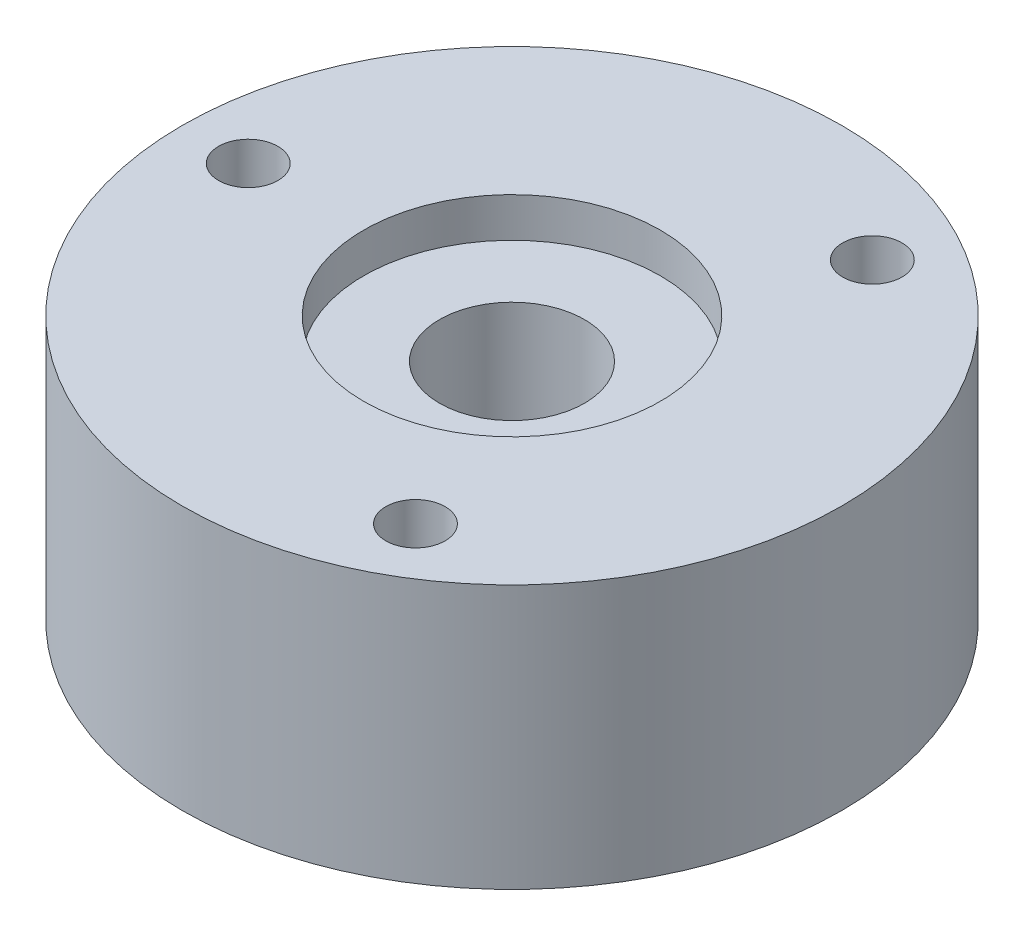
ISO-10303-21;
HEADER;
FILE_DESCRIPTION(('STEP AP214'),'2;1');
FILE_NAME('part.step','',(''),(''),'','','');
FILE_SCHEMA(('AUTOMOTIVE_DESIGN { 1 0 10303 214 1 1 1 1 }'));
ENDSEC;
DATA;
#1=APPLICATION_CONTEXT('core data for automotive mechanical design processes');
#2=APPLICATION_PROTOCOL_DEFINITION('international standard','automotive_design',2000,#1);
#3=PRODUCT_CONTEXT('',#1,'mechanical');
#4=PRODUCT('Part','Part','',(#3));
#5=PRODUCT_RELATED_PRODUCT_CATEGORY('part','',(#4));
#6=PRODUCT_DEFINITION_FORMATION('','',#4);
#7=PRODUCT_DEFINITION_CONTEXT('part definition',#1,'design');
#8=PRODUCT_DEFINITION('design','',#6,#7);
#9=PRODUCT_DEFINITION_SHAPE('','',#8);
#10=(LENGTH_UNIT() NAMED_UNIT(*) SI_UNIT(.MILLI.,.METRE.));
#11=(NAMED_UNIT(*) PLANE_ANGLE_UNIT() SI_UNIT($,.RADIAN.));
#12=(NAMED_UNIT(*) SI_UNIT($,.STERADIAN.) SOLID_ANGLE_UNIT());
#13=UNCERTAINTY_MEASURE_WITH_UNIT(LENGTH_MEASURE(1.E-05),#10,'distance_accuracy_value','');
#14=(GEOMETRIC_REPRESENTATION_CONTEXT(3) GLOBAL_UNCERTAINTY_ASSIGNED_CONTEXT((#13)) GLOBAL_UNIT_ASSIGNED_CONTEXT((#10,
#11,#12)) REPRESENTATION_CONTEXT('',''));
#15=CARTESIAN_POINT('',(0.,0.,0.));
#16=DIRECTION('',(0.,0.,1.));
#17=DIRECTION('',(1.,0.,0.));
#18=AXIS2_PLACEMENT_3D('',#15,#16,#17);
#19=CARTESIAN_POINT('',(0.,20.,0.));
#20=DIRECTION('',(0.,-1.,0.));
#21=DIRECTION('',(0.,0.,-1.));
#22=AXIS2_PLACEMENT_3D('',#19,#20,#21);
#23=CYLINDRICAL_SURFACE('',#22,5.5);
#24=CARTESIAN_POINT('',(0.,0.,0.));
#25=DIRECTION('',(0.,1.,0.));
#26=DIRECTION('',(0.,0.,1.));
#27=AXIS2_PLACEMENT_3D('',#24,#25,#26);
#28=CIRCLE('',#27,5.5);
#29=CARTESIAN_POINT('',(0.,0.,5.5));
#30=VERTEX_POINT('',#29);
#31=EDGE_CURVE('E43',#30,#30,#28,.T.);
#32=ORIENTED_EDGE('',*,*,#31,.F.);
#33=EDGE_LOOP('',(#32));
#34=FACE_BOUND('',#33,.T.);
#35=CARTESIAN_POINT('',(0.,17.,0.));
#36=DIRECTION('',(0.,1.,0.));
#37=DIRECTION('',(0.,0.,1.));
#38=AXIS2_PLACEMENT_3D('',#35,#36,#37);
#39=CIRCLE('',#38,5.5);
#40=CARTESIAN_POINT('',(0.,17.,5.5));
#41=VERTEX_POINT('',#40);
#42=EDGE_CURVE('E34',#41,#41,#39,.T.);
#43=ORIENTED_EDGE('',*,*,#42,.T.);
#44=EDGE_LOOP('',(#43));
#45=FACE_BOUND('',#44,.T.);
#46=ADVANCED_FACE('F30',(#34,#45),#23,.F.);
#47=CARTESIAN_POINT('',(0.,20.,0.));
#48=DIRECTION('',(0.,1.,0.));
#49=DIRECTION('',(0.,0.,1.));
#50=AXIS2_PLACEMENT_3D('',#47,#48,#49);
#51=PLANE('',#50);
#52=CARTESIAN_POINT('',(9.99999999999996,20.,-17.3205080756888));
#53=DIRECTION('',(0.,1.,0.));
#54=DIRECTION('',(0.866025403784436,0.,-0.500000000000004));
#55=AXIS2_PLACEMENT_3D('',#52,#53,#54);
#56=CIRCLE('',#55,2.25);
#57=CARTESIAN_POINT('',(11.9485571585149,20.,-18.4455080756888));
#58=VERTEX_POINT('',#57);
#59=EDGE_CURVE('E63',#58,#58,#56,.T.);
#60=ORIENTED_EDGE('',*,*,#59,.F.);
#61=EDGE_LOOP('',(#60));
#62=FACE_BOUND('',#61,.T.);
#63=CARTESIAN_POINT('',(-20.,20.,1.40512601554121E-13));
#64=DIRECTION('',(0.,1.,0.));
#65=DIRECTION('',(-0.866025403784443,0.,-0.499999999999992));
#66=AXIS2_PLACEMENT_3D('',#63,#64,#65);
#67=CIRCLE('',#66,2.25);
#68=CARTESIAN_POINT('',(-21.948557158515,20.,-1.12499999999984));
#69=VERTEX_POINT('',#68);
#70=EDGE_CURVE('E64',#69,#69,#67,.T.);
#71=ORIENTED_EDGE('',*,*,#70,.F.);
#72=EDGE_LOOP('',(#71));
#73=FACE_BOUND('',#72,.T.);
#74=CARTESIAN_POINT('',(9.99999999999996,20.,17.3205080756888));
#75=DIRECTION('',(0.,1.,0.));
#76=DIRECTION('',(0.,0.,1.));
#77=AXIS2_PLACEMENT_3D('',#74,#75,#76);
#78=CIRCLE('',#77,2.25);
#79=CARTESIAN_POINT('',(9.99999999999996,20.,19.5705080756888));
#80=VERTEX_POINT('',#79);
#81=EDGE_CURVE('E56',#80,#80,#78,.T.);
#82=ORIENTED_EDGE('',*,*,#81,.F.);
#83=EDGE_LOOP('',(#82));
#84=FACE_BOUND('',#83,.T.);
#85=CARTESIAN_POINT('',(0.,20.,0.));
#86=DIRECTION('',(0.,1.,0.));
#87=DIRECTION('',(0.,0.,1.));
#88=AXIS2_PLACEMENT_3D('',#85,#86,#87);
#89=CIRCLE('',#88,11.25);
#90=CARTESIAN_POINT('',(0.,20.,11.25));
#91=VERTEX_POINT('',#90);
#92=EDGE_CURVE('E47',#91,#91,#89,.T.);
#93=ORIENTED_EDGE('',*,*,#92,.F.);
#94=EDGE_LOOP('',(#93));
#95=FACE_BOUND('',#94,.T.);
#96=CARTESIAN_POINT('',(0.,20.,0.));
#97=DIRECTION('',(0.,1.,0.));
#98=DIRECTION('',(0.,0.,1.));
#99=AXIS2_PLACEMENT_3D('',#96,#97,#98);
#100=CIRCLE('',#99,25.);
#101=CARTESIAN_POINT('',(0.,20.,25.));
#102=VERTEX_POINT('',#101);
#103=EDGE_CURVE('E10',#102,#102,#100,.T.);
#104=ORIENTED_EDGE('',*,*,#103,.T.);
#105=EDGE_LOOP('',(#104));
#106=FACE_BOUND('',#105,.T.);
#107=ADVANCED_FACE('F74',(#62,#73,#84,#95,#106),#51,.T.);
#108=CARTESIAN_POINT('',(0.,0.,0.));
#109=DIRECTION('',(0.,1.,0.));
#110=DIRECTION('',(0.,0.,1.));
#111=AXIS2_PLACEMENT_3D('',#108,#109,#110);
#112=PLANE('',#111);
#113=CARTESIAN_POINT('',(9.99999999999996,0.,-17.3205080756888));
#114=DIRECTION('',(0.,1.,0.));
#115=DIRECTION('',(0.,0.,1.));
#116=AXIS2_PLACEMENT_3D('',#113,#114,#115);
#117=CIRCLE('',#116,2.25);
#118=CARTESIAN_POINT('',(9.99999999999996,0.,-15.0705080756888));
#119=VERTEX_POINT('',#118);
#120=EDGE_CURVE('E59',#119,#119,#117,.F.);
#121=ORIENTED_EDGE('',*,*,#120,.F.);
#122=EDGE_LOOP('',(#121));
#123=FACE_BOUND('',#122,.T.);
#124=CARTESIAN_POINT('',(-20.,0.,1.40512601554121E-13));
#125=DIRECTION('',(0.,1.,0.));
#126=DIRECTION('',(0.,0.,1.));
#127=AXIS2_PLACEMENT_3D('',#124,#125,#126);
#128=CIRCLE('',#127,2.25);
#129=CARTESIAN_POINT('',(-20.,0.,2.25000000000014));
#130=VERTEX_POINT('',#129);
#131=EDGE_CURVE('E60',#130,#130,#128,.F.);
#132=ORIENTED_EDGE('',*,*,#131,.F.);
#133=EDGE_LOOP('',(#132));
#134=FACE_BOUND('',#133,.T.);
#135=CARTESIAN_POINT('',(9.99999999999996,0.,17.3205080756888));
#136=DIRECTION('',(0.,1.,0.));
#137=DIRECTION('',(0.,0.,1.));
#138=AXIS2_PLACEMENT_3D('',#135,#136,#137);
#139=CIRCLE('',#138,2.25);
#140=CARTESIAN_POINT('',(9.99999999999996,0.,19.5705080756888));
#141=VERTEX_POINT('',#140);
#142=EDGE_CURVE('E51',#141,#141,#139,.F.);
#143=ORIENTED_EDGE('',*,*,#142,.F.);
#144=EDGE_LOOP('',(#143));
#145=FACE_BOUND('',#144,.T.);
#146=CARTESIAN_POINT('',(0.,0.,0.));
#147=DIRECTION('',(0.,1.,0.));
#148=DIRECTION('',(0.,0.,1.));
#149=AXIS2_PLACEMENT_3D('',#146,#147,#148);
#150=CIRCLE('',#149,25.);
#151=CARTESIAN_POINT('',(0.,0.,25.));
#152=VERTEX_POINT('',#151);
#153=EDGE_CURVE('E38',#152,#152,#150,.T.);
#154=ORIENTED_EDGE('',*,*,#153,.F.);
#155=EDGE_LOOP('',(#154));
#156=FACE_BOUND('',#155,.T.);
#157=ORIENTED_EDGE('',*,*,#31,.T.);
#158=EDGE_LOOP('',(#157));
#159=FACE_BOUND('',#158,.T.);
#160=ADVANCED_FACE('F77',(#123,#134,#145,#156,#159),#112,.F.);
#161=CARTESIAN_POINT('',(0.,20.,0.));
#162=DIRECTION('',(0.,-1.,0.));
#163=DIRECTION('',(0.,0.,-1.));
#164=AXIS2_PLACEMENT_3D('',#161,#162,#163);
#165=CYLINDRICAL_SURFACE('',#164,25.);
#166=ORIENTED_EDGE('',*,*,#103,.F.);
#167=EDGE_LOOP('',(#166));
#168=FACE_BOUND('',#167,.T.);
#169=ORIENTED_EDGE('',*,*,#153,.T.);
#170=EDGE_LOOP('',(#169));
#171=FACE_BOUND('',#170,.T.);
#172=ADVANCED_FACE('F32',(#168,#171),#165,.T.);
#173=CARTESIAN_POINT('',(0.,17.,0.));
#174=DIRECTION('',(0.,1.,0.));
#175=DIRECTION('',(0.,0.,1.));
#176=AXIS2_PLACEMENT_3D('',#173,#174,#175);
#177=CYLINDRICAL_SURFACE('',#176,11.25);
#178=CARTESIAN_POINT('',(0.,17.,0.));
#179=DIRECTION('',(0.,1.,0.));
#180=DIRECTION('',(0.,0.,1.));
#181=AXIS2_PLACEMENT_3D('',#178,#179,#180);
#182=CIRCLE('',#181,11.25);
#183=CARTESIAN_POINT('',(0.,17.,11.25));
#184=VERTEX_POINT('',#183);
#185=EDGE_CURVE('E50',#184,#184,#182,.T.);
#186=ORIENTED_EDGE('',*,*,#185,.F.);
#187=EDGE_LOOP('',(#186));
#188=FACE_BOUND('',#187,.T.);
#189=ORIENTED_EDGE('',*,*,#92,.T.);
#190=EDGE_LOOP('',(#189));
#191=FACE_BOUND('',#190,.T.);
#192=ADVANCED_FACE('F85',(#188,#191),#177,.F.);
#193=CARTESIAN_POINT('',(0.,17.,0.));
#194=DIRECTION('',(0.,1.,0.));
#195=DIRECTION('',(0.,0.,1.));
#196=AXIS2_PLACEMENT_3D('',#193,#194,#195);
#197=PLANE('',#196);
#198=ORIENTED_EDGE('',*,*,#42,.F.);
#199=EDGE_LOOP('',(#198));
#200=FACE_BOUND('',#199,.T.);
#201=ORIENTED_EDGE('',*,*,#185,.T.);
#202=EDGE_LOOP('',(#201));
#203=FACE_BOUND('',#202,.T.);
#204=ADVANCED_FACE('F87',(#200,#203),#197,.T.);
#205=CARTESIAN_POINT('',(9.99999999999996,-6.36396103067893,17.3205080756888));
#206=DIRECTION('',(0.,1.,0.));
#207=DIRECTION('',(0.,0.,1.));
#208=AXIS2_PLACEMENT_3D('',#205,#206,#207);
#209=CYLINDRICAL_SURFACE('',#208,2.25);
#210=ORIENTED_EDGE('',*,*,#142,.T.);
#211=EDGE_LOOP('',(#210));
#212=FACE_BOUND('',#211,.T.);
#213=ORIENTED_EDGE('',*,*,#81,.T.);
#214=EDGE_LOOP('',(#213));
#215=FACE_BOUND('',#214,.T.);
#216=ADVANCED_FACE('F94',(#212,#215),#209,.F.);
#217=CARTESIAN_POINT('',(-20.,-6.36396103067893,1.40512601554121E-13));
#218=DIRECTION('',(0.,1.,0.));
#219=DIRECTION('',(0.,0.,1.));
#220=AXIS2_PLACEMENT_3D('',#217,#218,#219);
#221=CYLINDRICAL_SURFACE('',#220,2.25);
#222=ORIENTED_EDGE('',*,*,#131,.T.);
#223=EDGE_LOOP('',(#222));
#224=FACE_BOUND('',#223,.T.);
#225=ORIENTED_EDGE('',*,*,#70,.T.);
#226=EDGE_LOOP('',(#225));
#227=FACE_BOUND('',#226,.T.);
#228=ADVANCED_FACE('F124',(#224,#227),#221,.F.);
#229=CARTESIAN_POINT('',(9.99999999999996,-6.36396103067893,-17.3205080756888));
#230=DIRECTION('',(0.,1.,0.));
#231=DIRECTION('',(0.,0.,1.));
#232=AXIS2_PLACEMENT_3D('',#229,#230,#231);
#233=CYLINDRICAL_SURFACE('',#232,2.25);
#234=ORIENTED_EDGE('',*,*,#120,.T.);
#235=EDGE_LOOP('',(#234));
#236=FACE_BOUND('',#235,.T.);
#237=ORIENTED_EDGE('',*,*,#59,.T.);
#238=EDGE_LOOP('',(#237));
#239=FACE_BOUND('',#238,.T.);
#240=ADVANCED_FACE('F72',(#236,#239),#233,.F.);
#241=CLOSED_SHELL('',(#46,#107,#160,#172,#192,#204,#216,#228,#240));
#242=MANIFOLD_SOLID_BREP('B2',#241);
#243=ADVANCED_BREP_SHAPE_REPRESENTATION('',(#18,#242),#14);
#244=SHAPE_DEFINITION_REPRESENTATION(#9,#243);
ENDSEC;
END-ISO-10303-21;
